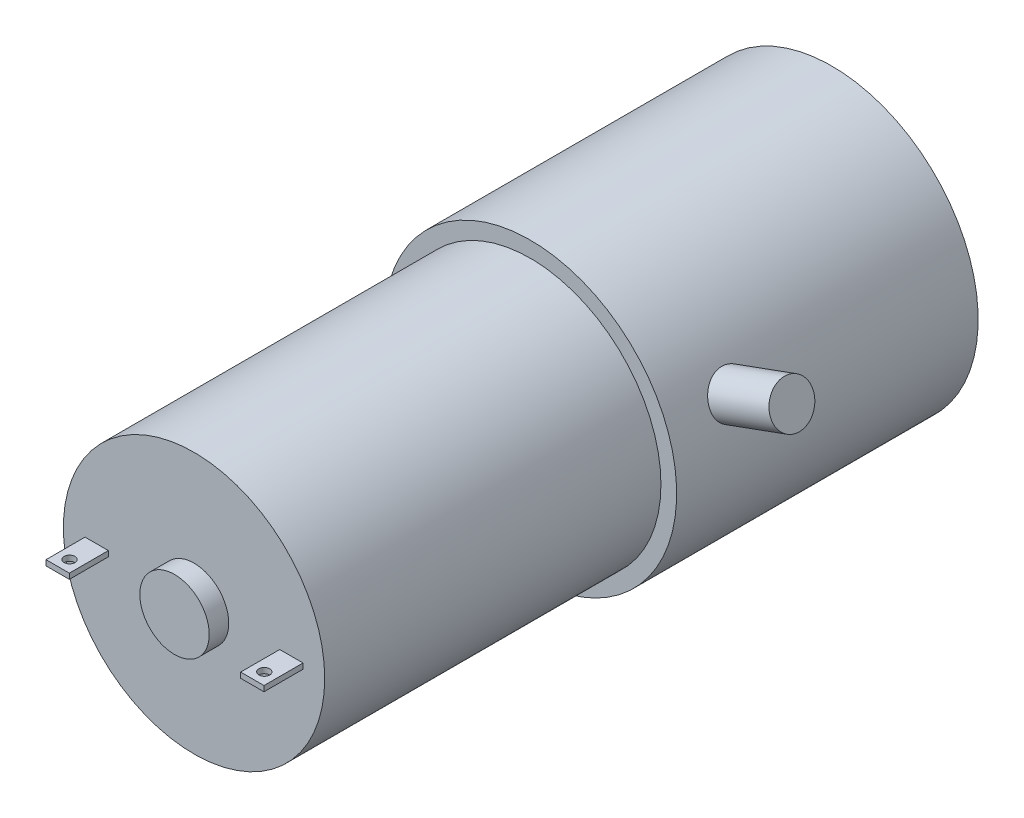
ISO-10303-21;
HEADER;
FILE_DESCRIPTION(('STEP AP214'),'2;1');
FILE_NAME('part.step','',(''),(''),'','','');
FILE_SCHEMA(('AUTOMOTIVE_DESIGN { 1 0 10303 214 1 1 1 1 }'));
ENDSEC;
DATA;
#1=APPLICATION_CONTEXT('core data for automotive mechanical design processes');
#2=APPLICATION_PROTOCOL_DEFINITION('international standard','automotive_design',2000,#1);
#3=PRODUCT_CONTEXT('',#1,'mechanical');
#4=PRODUCT('Part','Part','',(#3));
#5=PRODUCT_RELATED_PRODUCT_CATEGORY('part','',(#4));
#6=PRODUCT_DEFINITION_FORMATION('','',#4);
#7=PRODUCT_DEFINITION_CONTEXT('part definition',#1,'design');
#8=PRODUCT_DEFINITION('design','',#6,#7);
#9=PRODUCT_DEFINITION_SHAPE('','',#8);
#10=(LENGTH_UNIT() NAMED_UNIT(*) SI_UNIT(.MILLI.,.METRE.));
#11=(NAMED_UNIT(*) PLANE_ANGLE_UNIT() SI_UNIT($,.RADIAN.));
#12=(NAMED_UNIT(*) SI_UNIT($,.STERADIAN.) SOLID_ANGLE_UNIT());
#13=UNCERTAINTY_MEASURE_WITH_UNIT(LENGTH_MEASURE(1.E-05),#10,'distance_accuracy_value','');
#14=(GEOMETRIC_REPRESENTATION_CONTEXT(3) GLOBAL_UNCERTAINTY_ASSIGNED_CONTEXT((#13)) GLOBAL_UNIT_ASSIGNED_CONTEXT((#10,
#11,#12)) REPRESENTATION_CONTEXT('',''));
#15=CARTESIAN_POINT('',(0.,0.,0.));
#16=DIRECTION('',(0.,0.,1.));
#17=DIRECTION('',(1.,0.,0.));
#18=AXIS2_PLACEMENT_3D('',#15,#16,#17);
#19=CARTESIAN_POINT('',(0.,0.,-27.8));
#20=DIRECTION('',(0.,0.,1.));
#21=DIRECTION('',(1.,0.,0.));
#22=AXIS2_PLACEMENT_3D('',#19,#20,#21);
#23=CYLINDRICAL_SURFACE('',#22,13.5);
#24=CARTESIAN_POINT('',(11.8618240116873,6.44570640935378,-5.8));
#25=CARTESIAN_POINT('',(11.8618273306001,6.44570269599954,-5.68832250004053));
#26=CARTESIAN_POINT('',(11.8663650154933,6.43737133426295,-5.57657977350125));
#27=CARTESIAN_POINT('',(11.8842807071295,6.40423400663584,-5.35621737316534));
#28=CARTESIAN_POINT('',(11.8976673858833,6.37941187968115,-5.24760087214243));
#29=CARTESIAN_POINT('',(11.9325450005707,6.31393195201191,-5.03671257650749));
#30=CARTESIAN_POINT('',(11.9540297743752,6.2732861912931,-4.93443602633584));
#31=CARTESIAN_POINT('',(12.0039831063032,6.17716033944354,-4.73899137871991));
#32=CARTESIAN_POINT('',(12.0324506844094,6.12168232987973,-4.64582200567241));
#33=CARTESIAN_POINT('',(12.0951860411738,5.99678069479503,-4.47049377059504));
#34=CARTESIAN_POINT('',(12.1294929503214,5.92726235367362,-4.38841637419806));
#35=CARTESIAN_POINT('',(12.2021506198735,5.77620384997296,-4.23830775777425));
#36=CARTESIAN_POINT('',(12.2405016006982,5.69466303201781,-4.17027730396772));
#37=CARTESIAN_POINT('',(12.3197345084899,5.5211651731347,-4.04989374022314));
#38=CARTESIAN_POINT('',(12.3606274488576,5.42916113221729,-3.9976155545193));
#39=CARTESIAN_POINT('',(12.4430747978999,5.23743883488564,-3.91070125232641));
#40=CARTESIAN_POINT('',(12.4846291723495,5.13772097659016,-3.8760642260562));
#41=CARTESIAN_POINT('',(12.5665125008143,4.93403664582013,-3.8256621568463));
#42=CARTESIAN_POINT('',(12.606848200557,4.83010663698699,-3.80976076045143));
#43=CARTESIAN_POINT('',(12.6852625191331,4.6202444328631,-3.79685801083815));
#44=CARTESIAN_POINT('',(12.7233412603925,4.51431234658432,-3.79985563151803));
#45=CARTESIAN_POINT('',(12.7958923081977,4.30434507630716,-3.8245580861463));
#46=CARTESIAN_POINT('',(12.8303905233366,4.20030153376632,-3.84611622908412));
#47=CARTESIAN_POINT('',(12.8953938423495,3.99628426594821,-3.90709758968311));
#48=CARTESIAN_POINT('',(12.9258988454827,3.89631064339092,-3.94652125794479));
#49=CARTESIAN_POINT('',(12.9826034176716,3.70299923980816,-4.04226521309351));
#50=CARTESIAN_POINT('',(13.0087866624241,3.60968734192026,-4.09864739194364));
#51=CARTESIAN_POINT('',(13.0565637780151,3.43286236845385,-4.22666271132469));
#52=CARTESIAN_POINT('',(13.0781573538845,3.34934992282141,-4.29829683147623));
#53=CARTESIAN_POINT('',(13.1169962554871,3.19388537995698,-4.4556001409792));
#54=CARTESIAN_POINT('',(13.1341978776238,3.12205187657735,-4.54139738632934));
#55=CARTESIAN_POINT('',(13.1641658739375,2.99318025314766,-4.72415602068298));
#56=CARTESIAN_POINT('',(13.1769322220568,2.93614222002261,-4.8211174752726));
#57=CARTESIAN_POINT('',(13.1982718462404,2.83868335101574,-5.02358235658101));
#58=CARTESIAN_POINT('',(13.2068419845594,2.79827495365003,-5.12909210685114));
#59=CARTESIAN_POINT('',(13.2199844813577,2.73551605825961,-5.34558811033271));
#60=CARTESIAN_POINT('',(13.2245571143329,2.71316432034999,-5.45657398696312));
#61=CARTESIAN_POINT('',(13.2298121009355,2.6874235538431,-5.67974791786795));
#62=CARTESIAN_POINT('',(13.2305308321742,2.68385721248729,-5.79191468044793));
#63=CARTESIAN_POINT('',(13.2281974483095,2.6953339729038,-6.01524944244367));
#64=CARTESIAN_POINT('',(13.2251454472418,2.71037651190016,-6.12641747196103));
#65=CARTESIAN_POINT('',(13.2152059738523,2.75842745442242,-6.34404583073267));
#66=CARTESIAN_POINT('',(13.208337261721,2.79134796496362,-6.45052645842371));
#67=CARTESIAN_POINT('',(13.1906007823822,2.87399140336441,-6.65639715979711));
#68=CARTESIAN_POINT('',(13.1797328221427,2.92371514225763,-6.75578689094597));
#69=CARTESIAN_POINT('',(13.1536794713753,3.03878407994293,-6.94545776675718));
#70=CARTESIAN_POINT('',(13.1384629318067,3.1042414211613,-7.0356665862923));
#71=CARTESIAN_POINT('',(13.1035331311834,3.24852511284015,-7.20367189629207));
#72=CARTESIAN_POINT('',(13.0838196222759,3.32735220011965,-7.28146770220527));
#73=CARTESIAN_POINT('',(13.0395953855403,3.4966633764395,-7.42308059137243));
#74=CARTESIAN_POINT('',(13.0150470185666,3.58723688937029,-7.48677908725261));
#75=CARTESIAN_POINT('',(12.9613121969497,3.7767811654147,-7.59756343249452));
#76=CARTESIAN_POINT('',(12.9321258666739,3.87575170332818,-7.64464972720493));
#77=CARTESIAN_POINT('',(12.8695423904745,4.07873856107419,-7.72068307232066));
#78=CARTESIAN_POINT('',(12.8361608916861,4.18273529019221,-7.7496952563355));
#79=CARTESIAN_POINT('',(12.7657288667269,4.39300029340871,-7.78896771561731));
#80=CARTESIAN_POINT('',(12.7286785768383,4.49926842087651,-7.79922919766384));
#81=CARTESIAN_POINT('',(12.6522315532065,4.70993361219638,-7.80068006622067));
#82=CARTESIAN_POINT('',(12.6128606646877,4.81433884975738,-7.79205101132659));
#83=CARTESIAN_POINT('',(12.5326780262327,5.01937275593487,-7.7563545443685));
#84=CARTESIAN_POINT('',(12.4918662805794,5.12000143577524,-7.72928718710752));
#85=CARTESIAN_POINT('',(12.4102852304586,5.31469310277472,-7.65754629563875));
#86=CARTESIAN_POINT('',(12.3695159162215,5.40876061072857,-7.61288502794441));
#87=CARTESIAN_POINT('',(12.2895885502598,5.587991951583,-7.50724338944242));
#88=CARTESIAN_POINT('',(12.2504305483006,5.67315550961023,-7.44626251503985));
#89=CARTESIAN_POINT('',(12.1750366472406,5.83321460260226,-7.30905491674113));
#90=CARTESIAN_POINT('',(12.138830701033,5.90800925902558,-7.23269404254448));
#91=CARTESIAN_POINT('',(12.0713987018552,6.04459682783251,-7.06717620961239));
#92=CARTESIAN_POINT('',(12.0401738202456,6.10638668305962,-6.97801625034742));
#93=CARTESIAN_POINT('',(11.9840842820083,6.21574880069904,-6.78885831369618));
#94=CARTESIAN_POINT('',(11.959255365474,6.2632414098776,-6.68880369745492));
#95=CARTESIAN_POINT('',(11.9175008206363,6.3423333129689,-6.48113549051953));
#96=CARTESIAN_POINT('',(11.900566959894,6.37394916477339,-6.37352990882591));
#97=CARTESIAN_POINT('',(11.8793692033521,6.41333813969423,-6.18786242455918));
#98=CARTESIAN_POINT('',(11.8728069381968,6.42546036697872,-6.1109493732112));
#99=CARTESIAN_POINT('',(11.8640332099764,6.44164574887236,-5.95603482081603));
#100=CARTESIAN_POINT('',(11.8618216926362,6.44570900401618,-5.87803333335917));
#101=CARTESIAN_POINT('',(11.8618240116873,6.44570640935378,-5.8));
#102=B_SPLINE_CURVE_WITH_KNOTS('',3,(#24,#25,#26,#27,#28,#29,#30,#31,#32,#33,#34,#35,#36,#37,
#38,#39,#40,#41,#42,#43,#44,#45,#46,#47,#48,#49,#50,#51,#52,#53,#54,#55,#56,#57,#58,#59,#60,#61,
#62,#63,#64,#65,#66,#67,#68,#69,#70,#71,#72,#73,#74,#75,#76,#77,#78,#79,#80,#81,#82,#83,#84,#85,
#86,#87,#88,#89,#90,#91,#92,#93,#94,#95,#96,#97,#98,#99,#100,#101),.UNSPECIFIED.,.T.,.F.,(4,2,2,
2,2,2,2,2,2,2,2,2,2,2,2,2,2,2,2,2,2,2,2,2,2,2,2,2,2,2,2,2,2,2,2,2,2,2,4),(0.,0.334747291798368,
0.669823123137539,1.00464449640316,1.33941890527404,1.67653202496033,2.01366352834227,
2.35237413455001,2.69106727117258,3.02727994811855,3.36347437091783,3.69703585807941,
4.03060575872674,4.36540814410281,4.7002320400729,5.03826815969196,5.3763062652652,
5.71459675662513,6.05286401683671,6.38793262218518,6.72299109452502,7.05641704660648,
7.38985909430275,7.72575218505922,8.06166379321181,8.40030191768614,8.7389309630805,
9.0763325239956,9.41371236926208,9.74786387480075,10.0820143871658,10.4159323401973,
10.7498605985491,11.0868385403869,11.4238956104223,11.7627971564462,12.1013445237387,
12.3352481559781,12.5691488702801),.UNSPECIFIED.);
#103=CARTESIAN_POINT('',(11.8618240116873,6.44570640935378,-5.8));
#104=VERTEX_POINT('',#103);
#105=EDGE_CURVE('E11',#104,#104,#102,.T.);
#106=ORIENTED_EDGE('',*,*,#105,.F.);
#107=EDGE_LOOP('',(#106));
#108=FACE_BOUND('',#107,.T.);
#109=ADVANCED_FACE('F42',(#108),#23,.F.);
#110=CARTESIAN_POINT('',(18.3240061053252,6.66939279485055,-5.8));
#111=DIRECTION('',(0.939692620785908,0.342020143325669,0.));
#112=DIRECTION('',(-0.342020143325669,0.939692620785908,0.));
#113=AXIS2_PLACEMENT_3D('',#110,#111,#112);
#114=PLANE('',#113);
#115=CARTESIAN_POINT('',(18.3240061053252,6.66939279485055,-5.8));
#116=DIRECTION('',(0.939692620785908,0.342020143325669,0.));
#117=DIRECTION('',(-0.342020143325669,0.939692620785908,0.));
#118=AXIS2_PLACEMENT_3D('',#115,#116,#117);
#119=CIRCLE('',#118,2.);
#120=CARTESIAN_POINT('',(17.6399658186739,8.54877803642237,-5.8));
#121=VERTEX_POINT('',#120);
#122=EDGE_CURVE('E52',#121,#121,#119,.T.);
#123=ORIENTED_EDGE('',*,*,#122,.T.);
#124=EDGE_LOOP('',(#123));
#125=FACE_BOUND('',#124,.T.);
#126=ADVANCED_FACE('F58',(#125),#114,.T.);
#127=CARTESIAN_POINT('',(-499999.315959713,-181984.868162798,-5.8));
#128=DIRECTION('',(0.939692620785908,0.34202014332567,0.));
#129=DIRECTION('',(-0.34202014332567,0.939692620785908,0.));
#130=AXIS2_PLACEMENT_3D('',#127,#128,#129);
#131=CYLINDRICAL_SURFACE('',#130,2.);
#132=ORIENTED_EDGE('',*,*,#122,.F.);
#133=EDGE_LOOP('',(#132));
#134=FACE_BOUND('',#133,.T.);
#135=ORIENTED_EDGE('',*,*,#105,.T.);
#136=EDGE_LOOP('',(#135));
#137=FACE_BOUND('',#136,.T.);
#138=ADVANCED_FACE('F60',(#134,#137),#131,.T.);
#139=CLOSED_SHELL('',(#109,#126,#138));
#140=MANIFOLD_SOLID_BREP('B2',#139);
#141=CARTESIAN_POINT('',(0.,0.,31.));
#142=DIRECTION('',(0.,0.,1.));
#143=DIRECTION('',(1.,0.,0.));
#144=AXIS2_PLACEMENT_3D('',#141,#142,#143);
#145=PLANE('',#144);
#146=CARTESIAN_POINT('',(0.,0.,31.));
#147=DIRECTION('',(0.,0.,1.));
#148=DIRECTION('',(1.,0.,0.));
#149=AXIS2_PLACEMENT_3D('',#146,#147,#148);
#150=CIRCLE('',#149,3.2);
#151=CARTESIAN_POINT('',(3.2,0.,31.));
#152=VERTEX_POINT('',#151);
#153=EDGE_CURVE('E96',#152,#152,#150,.T.);
#154=ORIENTED_EDGE('',*,*,#153,.F.);
#155=EDGE_LOOP('',(#154));
#156=FACE_BOUND('',#155,.T.);
#157=CARTESIAN_POINT('',(0.,0.,31.));
#158=DIRECTION('',(0.,0.,1.));
#159=DIRECTION('',(1.,0.,0.));
#160=AXIS2_PLACEMENT_3D('',#157,#158,#159);
#161=CIRCLE('',#160,12.05);
#162=CARTESIAN_POINT('',(12.05,0.,31.));
#163=VERTEX_POINT('',#162);
#164=EDGE_CURVE('E227',#163,#163,#161,.T.);
#165=ORIENTED_EDGE('',*,*,#164,.T.);
#166=EDGE_LOOP('',(#165));
#167=FACE_BOUND('',#166,.T.);
#168=DIRECTION('',(-1.,0.,0.));
#169=VECTOR('',#168,1.);
#170=CARTESIAN_POINT('',(-10.05,-0.25,31.));
#171=LINE('',#170,#169);
#172=CARTESIAN_POINT('',(-7.89999999999999,-0.25,31.));
#173=VERTEX_POINT('',#172);
#174=CARTESIAN_POINT('',(-10.05,-0.25,31.));
#175=VERTEX_POINT('',#174);
#176=EDGE_CURVE('E112',#173,#175,#171,.T.);
#177=ORIENTED_EDGE('',*,*,#176,.T.);
#178=DIRECTION('',(0.,-1.,0.));
#179=VECTOR('',#178,1.);
#180=CARTESIAN_POINT('',(-10.05,0.25,31.));
#181=LINE('',#180,#179);
#182=CARTESIAN_POINT('',(-10.05,0.25,31.));
#183=VERTEX_POINT('',#182);
#184=EDGE_CURVE('E200',#183,#175,#181,.T.);
#185=ORIENTED_EDGE('',*,*,#184,.F.);
#186=DIRECTION('',(-1.,0.,0.));
#187=VECTOR('',#186,1.);
#188=CARTESIAN_POINT('',(-10.05,0.25,31.));
#189=LINE('',#188,#187);
#190=CARTESIAN_POINT('',(-7.89999999999999,0.25,31.));
#191=VERTEX_POINT('',#190);
#192=EDGE_CURVE('E198',#191,#183,#189,.T.);
#193=ORIENTED_EDGE('',*,*,#192,.F.);
#194=DIRECTION('',(0.,-1.,0.));
#195=VECTOR('',#194,1.);
#196=CARTESIAN_POINT('',(-7.89999999999999,0.25,31.));
#197=LINE('',#196,#195);
#198=EDGE_CURVE('E209',#191,#173,#197,.T.);
#199=ORIENTED_EDGE('',*,*,#198,.T.);
#200=EDGE_LOOP('',(#177,#185,#193,#199));
#201=FACE_BOUND('',#200,.T.);
#202=DIRECTION('',(-1.,0.,0.));
#203=VECTOR('',#202,1.);
#204=CARTESIAN_POINT('',(10.05,0.25,31.));
#205=LINE('',#204,#203);
#206=CARTESIAN_POINT('',(10.05,0.25,31.));
#207=VERTEX_POINT('',#206);
#208=CARTESIAN_POINT('',(7.89999999999999,0.25,31.));
#209=VERTEX_POINT('',#208);
#210=EDGE_CURVE('E166',#207,#209,#205,.T.);
#211=ORIENTED_EDGE('',*,*,#210,.F.);
#212=DIRECTION('',(0.,-1.,0.));
#213=VECTOR('',#212,1.);
#214=CARTESIAN_POINT('',(10.05,0.25,31.));
#215=LINE('',#214,#213);
#216=CARTESIAN_POINT('',(10.05,-0.25,31.));
#217=VERTEX_POINT('',#216);
#218=EDGE_CURVE('E163',#207,#217,#215,.T.);
#219=ORIENTED_EDGE('',*,*,#218,.T.);
#220=DIRECTION('',(-1.,0.,0.));
#221=VECTOR('',#220,1.);
#222=CARTESIAN_POINT('',(10.05,-0.25,31.));
#223=LINE('',#222,#221);
#224=CARTESIAN_POINT('',(7.89999999999999,-0.25,31.));
#225=VERTEX_POINT('',#224);
#226=EDGE_CURVE('E277',#217,#225,#223,.T.);
#227=ORIENTED_EDGE('',*,*,#226,.T.);
#228=DIRECTION('',(0.,-1.,0.));
#229=VECTOR('',#228,1.);
#230=CARTESIAN_POINT('',(7.89999999999999,0.25,31.));
#231=LINE('',#230,#229);
#232=EDGE_CURVE('E184',#209,#225,#231,.T.);
#233=ORIENTED_EDGE('',*,*,#232,.F.);
#234=EDGE_LOOP('',(#211,#219,#227,#233));
#235=FACE_BOUND('',#234,.T.);
#236=ADVANCED_FACE('F87',(#156,#167,#201,#235),#145,.T.);
#237=CARTESIAN_POINT('',(0.,0.,31.));
#238=DIRECTION('',(0.,0.,-1.));
#239=DIRECTION('',(-1.,0.,0.));
#240=AXIS2_PLACEMENT_3D('',#237,#238,#239);
#241=CYLINDRICAL_SURFACE('',#240,12.05);
#242=ORIENTED_EDGE('',*,*,#164,.F.);
#243=EDGE_LOOP('',(#242));
#244=FACE_BOUND('',#243,.T.);
#245=CARTESIAN_POINT('',(0.,0.,0.));
#246=DIRECTION('',(0.,0.,1.));
#247=DIRECTION('',(1.,0.,0.));
#248=AXIS2_PLACEMENT_3D('',#245,#246,#247);
#249=CIRCLE('',#248,12.05);
#250=CARTESIAN_POINT('',(12.05,0.,0.));
#251=VERTEX_POINT('',#250);
#252=EDGE_CURVE('E91',#251,#251,#249,.T.);
#253=ORIENTED_EDGE('',*,*,#252,.T.);
#254=EDGE_LOOP('',(#253));
#255=FACE_BOUND('',#254,.T.);
#256=ADVANCED_FACE('F89',(#244,#255),#241,.T.);
#257=CARTESIAN_POINT('',(0.,0.,-27.8));
#258=DIRECTION('',(0.,0.,1.));
#259=DIRECTION('',(1.,0.,0.));
#260=AXIS2_PLACEMENT_3D('',#257,#258,#259);
#261=CYLINDRICAL_SURFACE('',#260,13.5);
#262=CARTESIAN_POINT('',(0.,0.,-27.8));
#263=DIRECTION('',(0.,0.,-1.));
#264=DIRECTION('',(-1.,0.,0.));
#265=AXIS2_PLACEMENT_3D('',#262,#263,#264);
#266=CIRCLE('',#265,13.5);
#267=CARTESIAN_POINT('',(-13.5,0.,-27.8));
#268=VERTEX_POINT('',#267);
#269=EDGE_CURVE('E228',#268,#268,#266,.T.);
#270=ORIENTED_EDGE('',*,*,#269,.F.);
#271=EDGE_LOOP('',(#270));
#272=FACE_BOUND('',#271,.T.);
#273=CARTESIAN_POINT('',(0.,0.,0.));
#274=DIRECTION('',(0.,0.,-1.));
#275=DIRECTION('',(-1.,0.,0.));
#276=AXIS2_PLACEMENT_3D('',#273,#274,#275);
#277=CIRCLE('',#276,13.5);
#278=CARTESIAN_POINT('',(-13.5,0.,0.));
#279=VERTEX_POINT('',#278);
#280=EDGE_CURVE('E224',#279,#279,#277,.T.);
#281=ORIENTED_EDGE('',*,*,#280,.T.);
#282=EDGE_LOOP('',(#281));
#283=FACE_BOUND('',#282,.T.);
#284=ADVANCED_FACE('F247',(#272,#283),#261,.T.);
#285=CARTESIAN_POINT('',(0.,0.,-27.8));
#286=DIRECTION('',(0.,0.,-1.));
#287=DIRECTION('',(-1.,0.,0.));
#288=AXIS2_PLACEMENT_3D('',#285,#286,#287);
#289=PLANE('',#288);
#290=CARTESIAN_POINT('',(0.,0.,-27.8));
#291=DIRECTION('',(0.,0.,-1.));
#292=DIRECTION('',(-1.,0.,0.));
#293=AXIS2_PLACEMENT_3D('',#290,#291,#292);
#294=CIRCLE('',#293,2.2);
#295=CARTESIAN_POINT('',(-2.2,0.,-27.8));
#296=VERTEX_POINT('',#295);
#297=EDGE_CURVE('E40',#296,#296,#294,.T.);
#298=ORIENTED_EDGE('',*,*,#297,.F.);
#299=EDGE_LOOP('',(#298));
#300=FACE_BOUND('',#299,.T.);
#301=ORIENTED_EDGE('',*,*,#269,.T.);
#302=EDGE_LOOP('',(#301));
#303=FACE_BOUND('',#302,.T.);
#304=ADVANCED_FACE('F243',(#300,#303),#289,.T.);
#305=CARTESIAN_POINT('',(0.,0.,0.));
#306=DIRECTION('',(0.,0.,-1.));
#307=DIRECTION('',(-1.,0.,0.));
#308=AXIS2_PLACEMENT_3D('',#305,#306,#307);
#309=PLANE('',#308);
#310=ORIENTED_EDGE('',*,*,#252,.F.);
#311=EDGE_LOOP('',(#310));
#312=FACE_BOUND('',#311,.T.);
#313=ORIENTED_EDGE('',*,*,#280,.F.);
#314=EDGE_LOOP('',(#313));
#315=FACE_BOUND('',#314,.T.);
#316=ADVANCED_FACE('F239',(#312,#315),#309,.F.);
#317=CARTESIAN_POINT('',(0.,0.,32.8));
#318=DIRECTION('',(0.,0.,-1.));
#319=DIRECTION('',(-1.,0.,0.));
#320=AXIS2_PLACEMENT_3D('',#317,#318,#319);
#321=CYLINDRICAL_SURFACE('',#320,3.2);
#322=CARTESIAN_POINT('',(0.,0.,32.8));
#323=DIRECTION('',(0.,0.,1.));
#324=DIRECTION('',(1.,0.,0.));
#325=AXIS2_PLACEMENT_3D('',#322,#323,#324);
#326=CIRCLE('',#325,3.2);
#327=CARTESIAN_POINT('',(3.2,0.,32.8));
#328=VERTEX_POINT('',#327);
#329=EDGE_CURVE('E220',#328,#328,#326,.T.);
#330=ORIENTED_EDGE('',*,*,#329,.F.);
#331=EDGE_LOOP('',(#330));
#332=FACE_BOUND('',#331,.T.);
#333=ORIENTED_EDGE('',*,*,#153,.T.);
#334=EDGE_LOOP('',(#333));
#335=FACE_BOUND('',#334,.T.);
#336=ADVANCED_FACE('F242',(#332,#335),#321,.T.);
#337=CARTESIAN_POINT('',(0.,0.,32.8));
#338=DIRECTION('',(0.,0.,1.));
#339=DIRECTION('',(1.,0.,0.));
#340=AXIS2_PLACEMENT_3D('',#337,#338,#339);
#341=PLANE('',#340);
#342=ORIENTED_EDGE('',*,*,#329,.T.);
#343=EDGE_LOOP('',(#342));
#344=FACE_BOUND('',#343,.T.);
#345=ADVANCED_FACE('F340',(#344),#341,.T.);
#346=CARTESIAN_POINT('',(0.,0.,-33.8));
#347=DIRECTION('',(0.,0.,1.));
#348=DIRECTION('',(1.,0.,0.));
#349=AXIS2_PLACEMENT_3D('',#346,#347,#348);
#350=CYLINDRICAL_SURFACE('',#349,2.2);
#351=CARTESIAN_POINT('',(0.,0.,-33.8));
#352=DIRECTION('',(0.,0.,-1.));
#353=DIRECTION('',(-1.,0.,0.));
#354=AXIS2_PLACEMENT_3D('',#351,#352,#353);
#355=CIRCLE('',#354,2.2);
#356=CARTESIAN_POINT('',(-2.2,0.,-33.8));
#357=VERTEX_POINT('',#356);
#358=EDGE_CURVE('E218',#357,#357,#355,.T.);
#359=ORIENTED_EDGE('',*,*,#358,.F.);
#360=EDGE_LOOP('',(#359));
#361=FACE_BOUND('',#360,.T.);
#362=ORIENTED_EDGE('',*,*,#297,.T.);
#363=EDGE_LOOP('',(#362));
#364=FACE_BOUND('',#363,.T.);
#365=ADVANCED_FACE('F336',(#361,#364),#350,.T.);
#366=CARTESIAN_POINT('',(0.,0.,-33.8));
#367=DIRECTION('',(0.,0.,-1.));
#368=DIRECTION('',(-1.,0.,0.));
#369=AXIS2_PLACEMENT_3D('',#366,#367,#368);
#370=PLANE('',#369);
#371=ORIENTED_EDGE('',*,*,#358,.T.);
#372=EDGE_LOOP('',(#371));
#373=FACE_BOUND('',#372,.T.);
#374=ADVANCED_FACE('F319',(#373),#370,.T.);
#375=CARTESIAN_POINT('',(0.,0.25,0.));
#376=DIRECTION('',(0.,-1.,0.));
#377=DIRECTION('',(0.,0.,-1.));
#378=AXIS2_PLACEMENT_3D('',#375,#376,#377);
#379=PLANE('',#378);
#380=DIRECTION('',(0.,0.,1.));
#381=VECTOR('',#380,1.);
#382=CARTESIAN_POINT('',(-10.05,0.25,34.6));
#383=LINE('',#382,#381);
#384=CARTESIAN_POINT('',(-10.05,0.25,34.6));
#385=VERTEX_POINT('',#384);
#386=EDGE_CURVE('E191',#183,#385,#383,.T.);
#387=ORIENTED_EDGE('',*,*,#386,.T.);
#388=DIRECTION('',(1.,0.,0.));
#389=VECTOR('',#388,1.);
#390=CARTESIAN_POINT('',(-7.9,0.25,34.6));
#391=LINE('',#390,#389);
#392=CARTESIAN_POINT('',(-7.9,0.25,34.6));
#393=VERTEX_POINT('',#392);
#394=EDGE_CURVE('E194',#385,#393,#391,.T.);
#395=ORIENTED_EDGE('',*,*,#394,.T.);
#396=DIRECTION('',(0.,0.,-1.));
#397=VECTOR('',#396,1.);
#398=CARTESIAN_POINT('',(-7.89999999999999,0.25,31.));
#399=LINE('',#398,#397);
#400=EDGE_CURVE('E196',#393,#191,#399,.T.);
#401=ORIENTED_EDGE('',*,*,#400,.T.);
#402=ORIENTED_EDGE('',*,*,#192,.T.);
#403=EDGE_LOOP('',(#387,#395,#401,#402));
#404=FACE_BOUND('',#403,.T.);
#405=CARTESIAN_POINT('',(-8.975,0.25,33.5));
#406=DIRECTION('',(0.,1.,0.));
#407=DIRECTION('',(0.,0.,1.));
#408=AXIS2_PLACEMENT_3D('',#405,#406,#407);
#409=CIRCLE('',#408,0.500000000000001);
#410=CARTESIAN_POINT('',(-8.975,0.25,34.));
#411=VERTEX_POINT('',#410);
#412=EDGE_CURVE('E182',#411,#411,#409,.T.);
#413=ORIENTED_EDGE('',*,*,#412,.F.);
#414=EDGE_LOOP('',(#413));
#415=FACE_BOUND('',#414,.T.);
#416=ADVANCED_FACE('F315',(#404,#415),#379,.F.);
#417=CARTESIAN_POINT('',(0.,-0.25,0.));
#418=DIRECTION('',(0.,-1.,0.));
#419=DIRECTION('',(0.,0.,-1.));
#420=AXIS2_PLACEMENT_3D('',#417,#418,#419);
#421=PLANE('',#420);
#422=DIRECTION('',(0.,0.,1.));
#423=VECTOR('',#422,1.);
#424=CARTESIAN_POINT('',(-10.05,-0.25,34.6));
#425=LINE('',#424,#423);
#426=CARTESIAN_POINT('',(-10.05,-0.25,34.6));
#427=VERTEX_POINT('',#426);
#428=EDGE_CURVE('E189',#175,#427,#425,.T.);
#429=ORIENTED_EDGE('',*,*,#428,.F.);
#430=ORIENTED_EDGE('',*,*,#176,.F.);
#431=DIRECTION('',(0.,0.,-1.));
#432=VECTOR('',#431,1.);
#433=CARTESIAN_POINT('',(-7.89999999999999,-0.25,31.));
#434=LINE('',#433,#432);
#435=CARTESIAN_POINT('',(-7.9,-0.25,34.6));
#436=VERTEX_POINT('',#435);
#437=EDGE_CURVE('E205',#436,#173,#434,.T.);
#438=ORIENTED_EDGE('',*,*,#437,.F.);
#439=DIRECTION('',(1.,0.,0.));
#440=VECTOR('',#439,1.);
#441=CARTESIAN_POINT('',(-7.9,-0.25,34.6));
#442=LINE('',#441,#440);
#443=EDGE_CURVE('E203',#427,#436,#442,.T.);
#444=ORIENTED_EDGE('',*,*,#443,.F.);
#445=EDGE_LOOP('',(#429,#430,#438,#444));
#446=FACE_BOUND('',#445,.T.);
#447=CARTESIAN_POINT('',(-8.975,-0.25,33.5));
#448=DIRECTION('',(0.,1.,0.));
#449=DIRECTION('',(0.,0.,1.));
#450=AXIS2_PLACEMENT_3D('',#447,#448,#449);
#451=CIRCLE('',#450,0.500000000000001);
#452=CARTESIAN_POINT('',(-8.975,-0.25,34.));
#453=VERTEX_POINT('',#452);
#454=EDGE_CURVE('E179',#453,#453,#451,.T.);
#455=ORIENTED_EDGE('',*,*,#454,.T.);
#456=EDGE_LOOP('',(#455));
#457=FACE_BOUND('',#456,.T.);
#458=ADVANCED_FACE('F318',(#446,#457),#421,.T.);
#459=CARTESIAN_POINT('',(-10.05,0.25,34.6));
#460=DIRECTION('',(1.,0.,0.));
#461=DIRECTION('',(0.,0.,-1.));
#462=AXIS2_PLACEMENT_3D('',#459,#460,#461);
#463=PLANE('',#462);
#464=ORIENTED_EDGE('',*,*,#428,.T.);
#465=DIRECTION('',(0.,-1.,0.));
#466=VECTOR('',#465,1.);
#467=CARTESIAN_POINT('',(-10.05,0.25,34.6));
#468=LINE('',#467,#466);
#469=EDGE_CURVE('E215',#385,#427,#468,.T.);
#470=ORIENTED_EDGE('',*,*,#469,.F.);
#471=ORIENTED_EDGE('',*,*,#386,.F.);
#472=ORIENTED_EDGE('',*,*,#184,.T.);
#473=EDGE_LOOP('',(#464,#470,#471,#472));
#474=FACE_BOUND('',#473,.T.);
#475=ADVANCED_FACE('F323',(#474),#463,.F.);
#476=CARTESIAN_POINT('',(-7.9,0.25,34.6));
#477=DIRECTION('',(0.,0.,-1.));
#478=DIRECTION('',(-1.,0.,0.));
#479=AXIS2_PLACEMENT_3D('',#476,#477,#478);
#480=PLANE('',#479);
#481=ORIENTED_EDGE('',*,*,#443,.T.);
#482=DIRECTION('',(0.,-1.,0.));
#483=VECTOR('',#482,1.);
#484=CARTESIAN_POINT('',(-7.9,0.25,34.6));
#485=LINE('',#484,#483);
#486=EDGE_CURVE('E212',#393,#436,#485,.T.);
#487=ORIENTED_EDGE('',*,*,#486,.F.);
#488=ORIENTED_EDGE('',*,*,#394,.F.);
#489=ORIENTED_EDGE('',*,*,#469,.T.);
#490=EDGE_LOOP('',(#481,#487,#488,#489));
#491=FACE_BOUND('',#490,.T.);
#492=ADVANCED_FACE('F326',(#491),#480,.F.);
#493=CARTESIAN_POINT('',(-7.89999999999999,0.25,31.));
#494=DIRECTION('',(-1.,0.,0.));
#495=DIRECTION('',(0.,0.,1.));
#496=AXIS2_PLACEMENT_3D('',#493,#494,#495);
#497=PLANE('',#496);
#498=ORIENTED_EDGE('',*,*,#437,.T.);
#499=ORIENTED_EDGE('',*,*,#198,.F.);
#500=ORIENTED_EDGE('',*,*,#400,.F.);
#501=ORIENTED_EDGE('',*,*,#486,.T.);
#502=EDGE_LOOP('',(#498,#499,#500,#501));
#503=FACE_BOUND('',#502,.T.);
#504=ADVANCED_FACE('F304',(#503),#497,.F.);
#505=CARTESIAN_POINT('',(-8.975,0.25,33.5));
#506=DIRECTION('',(0.,-1.,0.));
#507=DIRECTION('',(0.,0.,-1.));
#508=AXIS2_PLACEMENT_3D('',#505,#506,#507);
#509=CYLINDRICAL_SURFACE('',#508,0.500000000000001);
#510=ORIENTED_EDGE('',*,*,#412,.T.);
#511=EDGE_LOOP('',(#510));
#512=FACE_BOUND('',#511,.T.);
#513=ORIENTED_EDGE('',*,*,#454,.F.);
#514=EDGE_LOOP('',(#513));
#515=FACE_BOUND('',#514,.T.);
#516=ADVANCED_FACE('F299',(#512,#515),#509,.F.);
#517=CARTESIAN_POINT('',(0.,0.25,0.));
#518=DIRECTION('',(0.,1.,0.));
#519=DIRECTION('',(0.,0.,1.));
#520=AXIS2_PLACEMENT_3D('',#517,#518,#519);
#521=PLANE('',#520);
#522=DIRECTION('',(1.,0.,0.));
#523=VECTOR('',#522,1.);
#524=CARTESIAN_POINT('',(7.9,0.25,34.6));
#525=LINE('',#524,#523);
#526=CARTESIAN_POINT('',(7.9,0.25,34.6));
#527=VERTEX_POINT('',#526);
#528=CARTESIAN_POINT('',(10.05,0.25,34.6));
#529=VERTEX_POINT('',#528);
#530=EDGE_CURVE('E167',#527,#529,#525,.T.);
#531=ORIENTED_EDGE('',*,*,#530,.T.);
#532=DIRECTION('',(0.,0.,-1.));
#533=VECTOR('',#532,1.);
#534=CARTESIAN_POINT('',(10.05,0.25,34.6));
#535=LINE('',#534,#533);
#536=EDGE_CURVE('E156',#529,#207,#535,.T.);
#537=ORIENTED_EDGE('',*,*,#536,.T.);
#538=ORIENTED_EDGE('',*,*,#210,.T.);
#539=DIRECTION('',(0.,0.,1.));
#540=VECTOR('',#539,1.);
#541=CARTESIAN_POINT('',(7.89999999999999,0.25,31.));
#542=LINE('',#541,#540);
#543=EDGE_CURVE('E104',#209,#527,#542,.T.);
#544=ORIENTED_EDGE('',*,*,#543,.T.);
#545=EDGE_LOOP('',(#531,#537,#538,#544));
#546=FACE_BOUND('',#545,.T.);
#547=CARTESIAN_POINT('',(8.975,0.25,33.5));
#548=DIRECTION('',(0.,1.,0.));
#549=DIRECTION('',(0.,0.,-1.));
#550=AXIS2_PLACEMENT_3D('',#547,#548,#549);
#551=CIRCLE('',#550,0.500000000000001);
#552=CARTESIAN_POINT('',(8.975,0.25,33.));
#553=VERTEX_POINT('',#552);
#554=EDGE_CURVE('E275',#553,#553,#551,.T.);
#555=ORIENTED_EDGE('',*,*,#554,.F.);
#556=EDGE_LOOP('',(#555));
#557=FACE_BOUND('',#556,.T.);
#558=ADVANCED_FACE('F170',(#546,#557),#521,.T.);
#559=CARTESIAN_POINT('',(0.,-0.25,0.));
#560=DIRECTION('',(0.,1.,0.));
#561=DIRECTION('',(0.,0.,1.));
#562=AXIS2_PLACEMENT_3D('',#559,#560,#561);
#563=PLANE('',#562);
#564=DIRECTION('',(1.,0.,0.));
#565=VECTOR('',#564,1.);
#566=CARTESIAN_POINT('',(7.9,-0.25,34.6));
#567=LINE('',#566,#565);
#568=CARTESIAN_POINT('',(7.9,-0.25,34.6));
#569=VERTEX_POINT('',#568);
#570=CARTESIAN_POINT('',(10.05,-0.25,34.6));
#571=VERTEX_POINT('',#570);
#572=EDGE_CURVE('E178',#569,#571,#567,.T.);
#573=ORIENTED_EDGE('',*,*,#572,.F.);
#574=DIRECTION('',(0.,0.,1.));
#575=VECTOR('',#574,1.);
#576=CARTESIAN_POINT('',(7.89999999999999,-0.25,31.));
#577=LINE('',#576,#575);
#578=EDGE_CURVE('E174',#225,#569,#577,.T.);
#579=ORIENTED_EDGE('',*,*,#578,.F.);
#580=ORIENTED_EDGE('',*,*,#226,.F.);
#581=DIRECTION('',(0.,0.,-1.));
#582=VECTOR('',#581,1.);
#583=CARTESIAN_POINT('',(10.05,-0.25,34.6));
#584=LINE('',#583,#582);
#585=EDGE_CURVE('E274',#571,#217,#584,.T.);
#586=ORIENTED_EDGE('',*,*,#585,.F.);
#587=EDGE_LOOP('',(#573,#579,#580,#586));
#588=FACE_BOUND('',#587,.T.);
#589=CARTESIAN_POINT('',(8.975,-0.25,33.5));
#590=DIRECTION('',(0.,1.,0.));
#591=DIRECTION('',(0.,0.,-1.));
#592=AXIS2_PLACEMENT_3D('',#589,#590,#591);
#593=CIRCLE('',#592,0.500000000000001);
#594=CARTESIAN_POINT('',(8.975,-0.25,33.));
#595=VERTEX_POINT('',#594);
#596=EDGE_CURVE('E290',#595,#595,#593,.T.);
#597=ORIENTED_EDGE('',*,*,#596,.T.);
#598=EDGE_LOOP('',(#597));
#599=FACE_BOUND('',#598,.T.);
#600=ADVANCED_FACE('F284',(#588,#599),#563,.F.);
#601=CARTESIAN_POINT('',(7.9,0.25,34.6));
#602=DIRECTION('',(0.,0.,-1.));
#603=DIRECTION('',(-1.,0.,0.));
#604=AXIS2_PLACEMENT_3D('',#601,#602,#603);
#605=PLANE('',#604);
#606=ORIENTED_EDGE('',*,*,#572,.T.);
#607=DIRECTION('',(0.,-1.,0.));
#608=VECTOR('',#607,1.);
#609=CARTESIAN_POINT('',(10.05,0.25,34.6));
#610=LINE('',#609,#608);
#611=EDGE_CURVE('E160',#529,#571,#610,.T.);
#612=ORIENTED_EDGE('',*,*,#611,.F.);
#613=ORIENTED_EDGE('',*,*,#530,.F.);
#614=DIRECTION('',(0.,-1.,0.));
#615=VECTOR('',#614,1.);
#616=CARTESIAN_POINT('',(7.9,0.25,34.6));
#617=LINE('',#616,#615);
#618=EDGE_CURVE('E270',#527,#569,#617,.T.);
#619=ORIENTED_EDGE('',*,*,#618,.T.);
#620=EDGE_LOOP('',(#606,#612,#613,#619));
#621=FACE_BOUND('',#620,.T.);
#622=ADVANCED_FACE('F176',(#621),#605,.F.);
#623=CARTESIAN_POINT('',(10.05,0.25,34.6));
#624=DIRECTION('',(-1.,0.,0.));
#625=DIRECTION('',(0.,0.,1.));
#626=AXIS2_PLACEMENT_3D('',#623,#624,#625);
#627=PLANE('',#626);
#628=ORIENTED_EDGE('',*,*,#585,.T.);
#629=ORIENTED_EDGE('',*,*,#218,.F.);
#630=ORIENTED_EDGE('',*,*,#536,.F.);
#631=ORIENTED_EDGE('',*,*,#611,.T.);
#632=EDGE_LOOP('',(#628,#629,#630,#631));
#633=FACE_BOUND('',#632,.T.);
#634=ADVANCED_FACE('F158',(#633),#627,.F.);
#635=CARTESIAN_POINT('',(7.89999999999999,0.25,31.));
#636=DIRECTION('',(1.,0.,0.));
#637=DIRECTION('',(0.,0.,-1.));
#638=AXIS2_PLACEMENT_3D('',#635,#636,#637);
#639=PLANE('',#638);
#640=ORIENTED_EDGE('',*,*,#578,.T.);
#641=ORIENTED_EDGE('',*,*,#618,.F.);
#642=ORIENTED_EDGE('',*,*,#543,.F.);
#643=ORIENTED_EDGE('',*,*,#232,.T.);
#644=EDGE_LOOP('',(#640,#641,#642,#643));
#645=FACE_BOUND('',#644,.T.);
#646=ADVANCED_FACE('F281',(#645),#639,.F.);
#647=CARTESIAN_POINT('',(8.975,0.25,33.5));
#648=DIRECTION('',(0.,-1.,0.));
#649=DIRECTION('',(0.,0.,-1.));
#650=AXIS2_PLACEMENT_3D('',#647,#648,#649);
#651=CYLINDRICAL_SURFACE('',#650,0.500000000000001);
#652=ORIENTED_EDGE('',*,*,#554,.T.);
#653=EDGE_LOOP('',(#652));
#654=FACE_BOUND('',#653,.T.);
#655=ORIENTED_EDGE('',*,*,#596,.F.);
#656=EDGE_LOOP('',(#655));
#657=FACE_BOUND('',#656,.T.);
#658=ADVANCED_FACE('F297',(#654,#657),#651,.F.);
#659=CLOSED_SHELL('',(#236,#256,#284,#304,#316,#336,#345,#365,#374,#416,#458,#475,#492,#504,
#516,#558,#600,#622,#634,#646,#658));
#660=MANIFOLD_SOLID_BREP('B6',#659);
#661=ADVANCED_BREP_SHAPE_REPRESENTATION('',(#18,#140,#660),#14);
#662=SHAPE_DEFINITION_REPRESENTATION(#9,#661);
ENDSEC;
END-ISO-10303-21;
